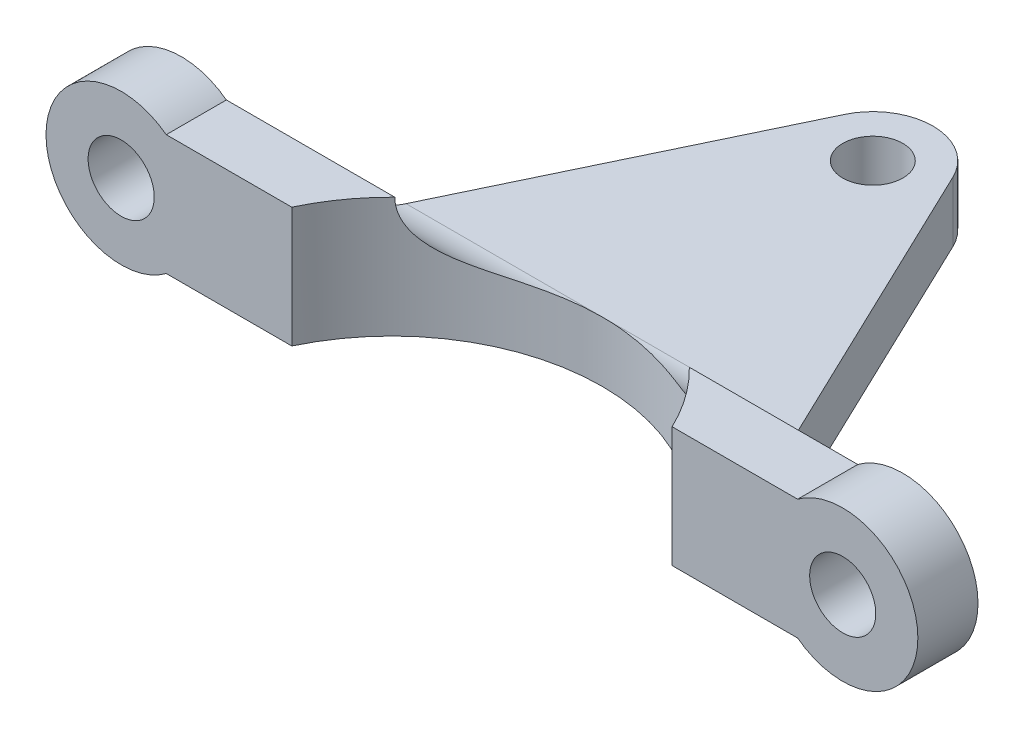
ISO-10303-21;
HEADER;
FILE_DESCRIPTION(('STEP AP214'),'2;1');
FILE_NAME('part.step','',(''),(''),'','','');
FILE_SCHEMA(('AUTOMOTIVE_DESIGN { 1 0 10303 214 1 1 1 1 }'));
ENDSEC;
DATA;
#1=APPLICATION_CONTEXT('core data for automotive mechanical design processes');
#2=APPLICATION_PROTOCOL_DEFINITION('international standard','automotive_design',2000,#1);
#3=PRODUCT_CONTEXT('',#1,'mechanical');
#4=PRODUCT('Part','Part','',(#3));
#5=PRODUCT_RELATED_PRODUCT_CATEGORY('part','',(#4));
#6=PRODUCT_DEFINITION_FORMATION('','',#4);
#7=PRODUCT_DEFINITION_CONTEXT('part definition',#1,'design');
#8=PRODUCT_DEFINITION('design','',#6,#7);
#9=PRODUCT_DEFINITION_SHAPE('','',#8);
#10=(LENGTH_UNIT() NAMED_UNIT(*) SI_UNIT(.MILLI.,.METRE.));
#11=(NAMED_UNIT(*) PLANE_ANGLE_UNIT() SI_UNIT($,.RADIAN.));
#12=(NAMED_UNIT(*) SI_UNIT($,.STERADIAN.) SOLID_ANGLE_UNIT());
#13=UNCERTAINTY_MEASURE_WITH_UNIT(LENGTH_MEASURE(1.E-05),#10,'distance_accuracy_value','');
#14=(GEOMETRIC_REPRESENTATION_CONTEXT(3) GLOBAL_UNCERTAINTY_ASSIGNED_CONTEXT((#13)) GLOBAL_UNIT_ASSIGNED_CONTEXT((#10,
#11,#12)) REPRESENTATION_CONTEXT('',''));
#15=CARTESIAN_POINT('',(0.,0.,0.));
#16=DIRECTION('',(0.,0.,1.));
#17=DIRECTION('',(1.,0.,0.));
#18=AXIS2_PLACEMENT_3D('',#15,#16,#17);
#19=CARTESIAN_POINT('',(0.,4.,0.));
#20=DIRECTION('',(0.,-1.,0.));
#21=DIRECTION('',(0.,0.,-1.));
#22=AXIS2_PLACEMENT_3D('',#19,#20,#21);
#23=CYLINDRICAL_SURFACE('',#22,7.);
#24=CARTESIAN_POINT('',(0.,4.,0.));
#25=DIRECTION('',(0.,1.,0.));
#26=DIRECTION('',(0.,0.,1.));
#27=AXIS2_PLACEMENT_3D('',#24,#25,#26);
#28=CIRCLE('',#27,7.);
#29=CARTESIAN_POINT('',(6.32455532033676,4.,-3.));
#30=VERTEX_POINT('',#29);
#31=CARTESIAN_POINT('',(4.89897948556636,4.,-5.));
#32=VERTEX_POINT('',#31);
#33=EDGE_CURVE('E322',#30,#32,#28,.T.);
#34=ORIENTED_EDGE('',*,*,#33,.T.);
#35=CARTESIAN_POINT('',(4.89897948556636,4.,-5.));
#36=CARTESIAN_POINT('',(4.89898466282606,3.95708928299442,-4.99999011477467));
#37=CARTESIAN_POINT('',(4.89757018635793,3.9141839310884,-5.00138071152142));
#38=CARTESIAN_POINT('',(4.89194243682955,3.82875317107511,-5.00688800031427));
#39=CARTESIAN_POINT('',(4.88773049843902,3.78622759157896,-5.01100339235699));
#40=CARTESIAN_POINT('',(4.87658371730419,3.70215140883431,-5.02185103416588));
#41=CARTESIAN_POINT('',(4.86966630909403,3.6605963332607,-5.0285665256923));
#42=CARTESIAN_POINT('',(4.85318900762016,3.57850582164685,-5.04447097514826));
#43=CARTESIAN_POINT('',(4.84362892737339,3.53797045797812,-5.05366010809983));
#44=CARTESIAN_POINT('',(4.81114979223824,3.41844524355401,-5.08465712922374));
#45=CARTESIAN_POINT('',(4.78440453850835,3.34133360602846,-5.10992194457505));
#46=CARTESIAN_POINT('',(4.72171847616023,3.19395103767314,-5.16790006243462));
#47=CARTESIAN_POINT('',(4.68576435549299,3.12369021490155,-5.20062414021882));
#48=CARTESIAN_POINT('',(4.59402216521894,2.97139945255398,-5.28201851181334));
#49=CARTESIAN_POINT('',(4.53551155914074,2.89200276999284,-5.33254617720228));
#50=CARTESIAN_POINT('',(4.40753583535792,2.74668487280889,-5.43880022426775));
#51=CARTESIAN_POINT('',(4.33805448474776,2.68078396452408,-5.49453425885883));
#52=CARTESIAN_POINT('',(4.2119291391148,2.57897225407792,-5.59142495749553));
#53=CARTESIAN_POINT('',(4.15741154816274,2.53990834494939,-5.63211804176578));
#54=CARTESIAN_POINT('',(4.0446870193621,2.46762638465617,-5.71361151161102));
#55=CARTESIAN_POINT('',(3.98647853424944,2.43441080751055,-5.75441193522174));
#56=CARTESIAN_POINT('',(3.80708383366466,2.3426298578724,-5.8759578696499));
#57=CARTESIAN_POINT('',(3.68119367474349,2.29198045069178,-5.95579714827815));
#58=CARTESIAN_POINT('',(3.44473424496656,2.2150406050174,-6.0950069083447));
#59=CARTESIAN_POINT('',(3.33562380754296,2.18598001799254,-6.15543607470735));
#60=CARTESIAN_POINT('',(3.11271522049934,2.13648995527161,-6.27110502722358));
#61=CARTESIAN_POINT('',(2.99891413042119,2.1160659868301,-6.32634148477412));
#62=CARTESIAN_POINT('',(2.76717212072766,2.08182378110782,-6.43109751360487));
#63=CARTESIAN_POINT('',(2.64921521027134,2.06803495858494,-6.4805909031358));
#64=CARTESIAN_POINT('',(2.41037925029539,2.04549887496969,-6.57316349526375));
#65=CARTESIAN_POINT('',(2.28950051317153,2.03675107736374,-6.61624338008454));
#66=CARTESIAN_POINT('',(1.99205542058784,2.01983132624954,-6.71310073666584));
#67=CARTESIAN_POINT('',(1.81422086313912,2.01357880821182,-6.76333520003789));
#68=CARTESIAN_POINT('',(1.45496991275704,2.00519125049863,-6.84961421178335));
#69=CARTESIAN_POINT('',(1.27355175224546,2.00305829671849,-6.88565156426122));
#70=CARTESIAN_POINT('',(1.00081484904496,2.00122353260286,-6.92868797589409));
#71=CARTESIAN_POINT('',(0.910331396789563,2.00083774674185,-6.94115545685817));
#72=CARTESIAN_POINT('',(0.728939698067638,2.00032170476223,-6.96254154349201));
#73=CARTESIAN_POINT('',(0.638031449812267,2.00019144972064,-6.97146013420351));
#74=CARTESIAN_POINT('',(0.456005424101805,2.00003767085754,-6.98572738059479));
#75=CARTESIAN_POINT('',(0.364887855905197,2.00001406676058,-6.99107871873402));
#76=CARTESIAN_POINT('',(0.182513762976024,2.00000026006483,-6.9982154545832));
#77=CARTESIAN_POINT('',(0.0912572391382384,2.00001005725185,-7.00000087515889));
#78=CARTESIAN_POINT('',(0.,1.99999999999999,-7.));
#79=B_SPLINE_CURVE_WITH_KNOTS('',3,(#35,#36,#37,#38,#39,#40,#41,#42,#43,#44,#45,#46,#47,#48,#49,
#50,#51,#52,#53,#54,#55,#56,#57,#58,#59,#60,#61,#62,#63,#64,#65,#66,#67,#68,#69,#70,#71,#72,#73,
#74,#75,#76,#77,#78),.UNSPECIFIED.,.F.,.F.,(4,2,2,2,2,2,2,2,2,2,2,2,2,2,2,2,2,2,2,2,2,4),(0.,
0.128677468159636,0.257293588327713,0.385094188754635,0.51290383406723,0.767912545999841,
1.02329199178864,1.35392829229567,1.6850584856187,1.92009035501073,2.15522141226318,
2.62577047129787,3.00950013363205,3.39347411864318,3.77913499361177,4.1647548153162,
4.71876068902529,5.27304700395315,5.54700670440895,5.82096755956902,6.09472217186828,
6.36847502876601),.UNSPECIFIED.);
#80=CARTESIAN_POINT('',(0.,2.,-7.));
#81=VERTEX_POINT('',#80);
#82=EDGE_CURVE('E234',#32,#81,#79,.T.);
#83=ORIENTED_EDGE('',*,*,#82,.T.);
#84=CARTESIAN_POINT('',(0.,2.,-7.));
#85=CARTESIAN_POINT('',(-0.0841627374007762,2.00000728041462,-7.0000006328622));
#86=CARTESIAN_POINT('',(-0.168324922142837,2.00000018950094,-6.99848213625596));
#87=CARTESIAN_POINT('',(-0.336540175151096,2.00001017569657,-6.99241173202552));
#88=CARTESIAN_POINT('',(-0.420593242963904,2.00002725290597,-6.98785981183734));
#89=CARTESIAN_POINT('',(-0.588521877138404,2.00013851356098,-6.9757244943503));
#90=CARTESIAN_POINT('',(-0.672397338835235,2.00023273404299,-6.9681396418384));
#91=CARTESIAN_POINT('',(-0.839815318769446,2.00060602194847,-6.94994977008053));
#92=CARTESIAN_POINT('',(-0.923357838037522,2.00088508879926,-6.93934476019147));
#93=CARTESIAN_POINT('',(-1.17464977939364,2.00220909662432,-6.90282515704987));
#94=CARTESIAN_POINT('',(-1.34175132320898,2.00374401545431,-6.87230054740542));
#95=CARTESIAN_POINT('',(-1.67319288607253,2.00976723653442,-6.79920673672789));
#96=CARTESIAN_POINT('',(-1.83753380558358,2.01425455580116,-6.75664154721906));
#97=CARTESIAN_POINT('',(-2.12042428628811,2.02669767249671,-6.6723006776526));
#98=CARTESIAN_POINT('',(-2.23981856661201,2.03345543342297,-6.63317101216628));
#99=CARTESIAN_POINT('',(-2.47608389806751,2.0511168278646,-6.54864464209965));
#100=CARTESIAN_POINT('',(-2.59295476015103,2.06202077087033,-6.5032474698446));
#101=CARTESIAN_POINT('',(-2.82319701048555,2.08938680948406,-6.40664409421189));
#102=CARTESIAN_POINT('',(-2.93657819099,2.10583143402452,-6.35545648236016));
#103=CARTESIAN_POINT('',(-3.15938039993261,2.14599582705055,-6.24768950820328));
#104=CARTESIAN_POINT('',(-3.26880329543186,2.16971211423311,-6.19111273487047));
#105=CARTESIAN_POINT('',(-3.51049505850911,2.23377817505717,-6.05805442110603));
#106=CARTESIAN_POINT('',(-3.64133107828445,2.27684636029529,-5.98021548603693));
#107=CARTESIAN_POINT('',(-3.89215354511507,2.38231059023905,-5.82006458379569));
#108=CARTESIAN_POINT('',(-4.01215382005732,2.44468153849342,-5.73775853845067));
#109=CARTESIAN_POINT('',(-4.2074374400217,2.57394246442586,-5.59536113582006));
#110=CARTESIAN_POINT('',(-4.2861933163182,2.63535478470063,-5.53510625526514));
#111=CARTESIAN_POINT('',(-4.43300941787114,2.77276939323256,-5.41822674488224));
#112=CARTESIAN_POINT('',(-4.50108557561797,2.84874956482298,-5.36159678341559));
#113=CARTESIAN_POINT('',(-4.61109926505255,2.99847108871577,-5.26706004179829));
#114=CARTESIAN_POINT('',(-4.65553245184837,3.06944900790252,-5.22769948851465));
#115=CARTESIAN_POINT('',(-4.73441211550996,3.22026998718729,-5.15637201663202));
#116=CARTESIAN_POINT('',(-4.76885723998095,3.3001142457753,-5.12440609939339));
#117=CARTESIAN_POINT('',(-4.82654018371074,3.46766670547408,-5.07011932778717));
#118=CARTESIAN_POINT('',(-4.84968537252599,3.55543313758997,-5.04787834270229));
#119=CARTESIAN_POINT('',(-4.88318147219514,3.73541218706479,-5.01548604832721));
#120=CARTESIAN_POINT('',(-4.89357005407435,3.82761087366158,-5.00529914586385));
#121=CARTESIAN_POINT('',(-4.89789430940729,3.93343545799923,-5.00106279926394));
#122=CARTESIAN_POINT('',(-4.89830137001528,3.94674961597304,-5.00066421068768));
#123=CARTESIAN_POINT('',(-4.89884348783352,3.97337443752132,-5.00013338919784));
#124=CARTESIAN_POINT('',(-4.89897883755824,3.98668508941215,-5.0000008698434));
#125=CARTESIAN_POINT('',(-4.89897948556637,4.,-5.));
#126=B_SPLINE_CURVE_WITH_KNOTS('',3,(#84,#85,#86,#87,#88,#89,#90,#91,#92,#93,#94,#95,#96,#97,
#98,#99,#100,#101,#102,#103,#104,#105,#106,#107,#108,#109,#110,#111,#112,#113,#114,#115,#116,
#117,#118,#119,#120,#121,#122,#123,#124,#125),.UNSPECIFIED.,.F.,.F.,(4,2,2,2,2,2,2,2,2,2,2,2,2,
2,2,2,2,2,2,2,4),(0.,0.252473432377999,0.504947910469367,0.757543672456671,1.0101386518705,
1.51926623204327,2.02822438707148,2.40547777686093,2.78275933213095,3.15886219389698,
3.53478527710818,4.00818074615952,4.48096329844102,4.82972084102823,5.17795303933857,
5.4544453873116,5.73097515519377,6.0097352078388,6.28767007013125,6.32764799491806,
6.36758285773509),.UNSPECIFIED.);
#127=CARTESIAN_POINT('',(-4.89897948556636,4.,-5.));
#128=VERTEX_POINT('',#127);
#129=EDGE_CURVE('E257',#81,#128,#126,.T.);
#130=ORIENTED_EDGE('',*,*,#129,.T.);
#131=CARTESIAN_POINT('',(-6.32455532033676,4.,-3.));
#132=VERTEX_POINT('',#131);
#133=EDGE_CURVE('E296',#128,#132,#28,.T.);
#134=ORIENTED_EDGE('',*,*,#133,.T.);
#135=DIRECTION('',(0.,-1.,0.));
#136=VECTOR('',#135,1.);
#137=CARTESIAN_POINT('',(-6.32455532033676,4.,-3.));
#138=LINE('',#137,#136);
#139=CARTESIAN_POINT('',(-6.32455532033676,0.,-3.));
#140=VERTEX_POINT('',#139);
#141=EDGE_CURVE('E211',#132,#140,#138,.T.);
#142=ORIENTED_EDGE('',*,*,#141,.T.);
#143=CARTESIAN_POINT('',(0.,0.,0.));
#144=DIRECTION('',(0.,1.,0.));
#145=DIRECTION('',(0.,0.,1.));
#146=AXIS2_PLACEMENT_3D('',#143,#144,#145);
#147=CIRCLE('',#146,7.);
#148=CARTESIAN_POINT('',(6.32455532033676,0.,-3.));
#149=VERTEX_POINT('',#148);
#150=EDGE_CURVE('E183',#149,#140,#147,.T.);
#151=ORIENTED_EDGE('',*,*,#150,.F.);
#152=DIRECTION('',(0.,-1.,0.));
#153=VECTOR('',#152,1.);
#154=CARTESIAN_POINT('',(6.32455532033676,4.,-3.));
#155=LINE('',#154,#153);
#156=EDGE_CURVE('E182',#30,#149,#155,.T.);
#157=ORIENTED_EDGE('',*,*,#156,.F.);
#158=EDGE_LOOP('',(#34,#83,#130,#134,#142,#151,#157));
#159=FACE_BOUND('',#158,.T.);
#160=ADVANCED_FACE('F53',(#159),#23,.F.);
#161=CARTESIAN_POINT('',(8.03540956693639,4.,-3.84673390666092));
#162=DIRECTION('',(-0.901971979461699,0.,0.431794567202905));
#163=DIRECTION('',(0.431794567202905,0.,0.901971979461699));
#164=AXIS2_PLACEMENT_3D('',#161,#162,#163);
#165=PLANE('',#164);
#166=DIRECTION('',(-0.431794567202905,0.,-0.901971979461699));
#167=VECTOR('',#166,1.);
#168=CARTESIAN_POINT('',(8.03540956693639,2.,-3.84673390666092));
#169=LINE('',#168,#167);
#170=CARTESIAN_POINT('',(6.52586913879413,2.,-7.));
#171=VERTEX_POINT('',#170);
#172=CARTESIAN_POINT('',(1.8039439589234,2.,-16.8635891344058));
#173=VERTEX_POINT('',#172);
#174=EDGE_CURVE('E317',#171,#173,#169,.T.);
#175=ORIENTED_EDGE('',*,*,#174,.F.);
#176=CARTESIAN_POINT('',(6.52586913879413,4.,-7.));
#177=DIRECTION('',(-0.901971979461699,0.,0.431794567202905));
#178=DIRECTION('',(0.431794567202905,0.,0.901971979461699));
#179=AXIS2_PLACEMENT_3D('',#176,#177,#178);
#180=ELLIPSE('',#179,2.21736378240221,2.);
#181=CARTESIAN_POINT('',(6.66727605663546,2.02193314854529,-6.70461629839128));
#182=VERTEX_POINT('',#181);
#183=EDGE_CURVE('E241',#171,#182,#180,.T.);
#184=ORIENTED_EDGE('',*,*,#183,.T.);
#185=DIRECTION('',(0.,-1.,0.));
#186=VECTOR('',#185,1.);
#187=CARTESIAN_POINT('',(6.66727605663546,4.,-6.70461629839128));
#188=LINE('',#187,#186);
#189=CARTESIAN_POINT('',(6.66727605663546,0.,-6.70461629839128));
#190=VERTEX_POINT('',#189);
#191=EDGE_CURVE('E77',#182,#190,#188,.T.);
#192=ORIENTED_EDGE('',*,*,#191,.T.);
#193=DIRECTION('',(-0.431794567202905,0.,-0.901971979461699));
#194=VECTOR('',#193,1.);
#195=CARTESIAN_POINT('',(8.03540956693639,0.,-3.84673390666092));
#196=LINE('',#195,#194);
#197=CARTESIAN_POINT('',(1.8039439589234,0.,-16.8635891344058));
#198=VERTEX_POINT('',#197);
#199=EDGE_CURVE('E185',#190,#198,#196,.T.);
#200=ORIENTED_EDGE('',*,*,#199,.T.);
#201=DIRECTION('',(0.,-1.,0.));
#202=VECTOR('',#201,1.);
#203=CARTESIAN_POINT('',(1.8039439589234,4.,-16.8635891344058));
#204=LINE('',#203,#202);
#205=EDGE_CURVE('E206',#173,#198,#204,.T.);
#206=ORIENTED_EDGE('',*,*,#205,.F.);
#207=EDGE_LOOP('',(#175,#184,#192,#200,#206));
#208=FACE_BOUND('',#207,.T.);
#209=ADVANCED_FACE('F250',(#208),#165,.F.);
#210=CARTESIAN_POINT('',(0.,4.,-16.));
#211=DIRECTION('',(0.,-1.,0.));
#212=DIRECTION('',(0.,0.,-1.));
#213=AXIS2_PLACEMENT_3D('',#210,#211,#212);
#214=CYLINDRICAL_SURFACE('',#213,2.);
#215=CARTESIAN_POINT('',(0.,2.,-16.));
#216=DIRECTION('',(0.,1.,0.));
#217=DIRECTION('',(0.,0.,1.));
#218=AXIS2_PLACEMENT_3D('',#215,#216,#217);
#219=CIRCLE('',#218,2.);
#220=CARTESIAN_POINT('',(-1.8039439589234,2.,-16.8635891344058));
#221=VERTEX_POINT('',#220);
#222=EDGE_CURVE('E345',#173,#221,#219,.T.);
#223=ORIENTED_EDGE('',*,*,#222,.F.);
#224=ORIENTED_EDGE('',*,*,#205,.T.);
#225=CARTESIAN_POINT('',(0.,0.,-16.));
#226=DIRECTION('',(0.,1.,0.));
#227=DIRECTION('',(0.,0.,1.));
#228=AXIS2_PLACEMENT_3D('',#225,#226,#227);
#229=CIRCLE('',#228,2.);
#230=CARTESIAN_POINT('',(-1.8039439589234,0.,-16.8635891344058));
#231=VERTEX_POINT('',#230);
#232=EDGE_CURVE('E192',#198,#231,#229,.T.);
#233=ORIENTED_EDGE('',*,*,#232,.T.);
#234=DIRECTION('',(0.,-1.,0.));
#235=VECTOR('',#234,1.);
#236=CARTESIAN_POINT('',(-1.8039439589234,4.,-16.8635891344058));
#237=LINE('',#236,#235);
#238=EDGE_CURVE('E203',#221,#231,#237,.T.);
#239=ORIENTED_EDGE('',*,*,#238,.F.);
#240=EDGE_LOOP('',(#223,#224,#233,#239));
#241=FACE_BOUND('',#240,.T.);
#242=ADVANCED_FACE('F354',(#241),#214,.T.);
#243=CARTESIAN_POINT('',(-8.03540956693639,4.,-3.84673390666092));
#244=DIRECTION('',(-0.901971979461699,0.,-0.431794567202905));
#245=DIRECTION('',(-0.431794567202905,0.,0.901971979461699));
#246=AXIS2_PLACEMENT_3D('',#243,#244,#245);
#247=PLANE('',#246);
#248=DIRECTION('',(0.431794567202905,0.,-0.901971979461699));
#249=VECTOR('',#248,1.);
#250=CARTESIAN_POINT('',(-8.03540956693639,0.,-3.84673390666092));
#251=LINE('',#250,#249);
#252=CARTESIAN_POINT('',(-6.66727605663546,0.,-6.70461629839128));
#253=VERTEX_POINT('',#252);
#254=EDGE_CURVE('E195',#253,#231,#251,.T.);
#255=ORIENTED_EDGE('',*,*,#254,.F.);
#256=DIRECTION('',(0.,-1.,0.));
#257=VECTOR('',#256,1.);
#258=CARTESIAN_POINT('',(-6.66727605663546,2.,-6.70461629839128));
#259=LINE('',#258,#257);
#260=CARTESIAN_POINT('',(-6.66727605663546,2.02193314854529,-6.70461629839128));
#261=VERTEX_POINT('',#260);
#262=EDGE_CURVE('E69',#253,#261,#259,.F.);
#263=ORIENTED_EDGE('',*,*,#262,.T.);
#264=CARTESIAN_POINT('',(-6.52586913879413,4.,-7.));
#265=DIRECTION('',(-0.901971979461699,0.,-0.431794567202905));
#266=DIRECTION('',(0.431794567202905,0.,-0.901971979461699));
#267=AXIS2_PLACEMENT_3D('',#264,#265,#266);
#268=ELLIPSE('',#267,2.21736378240221,2.);
#269=CARTESIAN_POINT('',(-6.52586913879413,2.,-7.));
#270=VERTEX_POINT('',#269);
#271=EDGE_CURVE('E263',#261,#270,#268,.F.);
#272=ORIENTED_EDGE('',*,*,#271,.T.);
#273=DIRECTION('',(0.431794567202905,0.,-0.901971979461699));
#274=VECTOR('',#273,1.);
#275=CARTESIAN_POINT('',(-8.03540956693639,2.,-3.84673390666092));
#276=LINE('',#275,#274);
#277=EDGE_CURVE('E216',#270,#221,#276,.T.);
#278=ORIENTED_EDGE('',*,*,#277,.T.);
#279=ORIENTED_EDGE('',*,*,#238,.T.);
#280=EDGE_LOOP('',(#255,#263,#272,#278,#279));
#281=FACE_BOUND('',#280,.T.);
#282=ADVANCED_FACE('F357',(#281),#247,.T.);
#283=CARTESIAN_POINT('',(0.,4.,-16.));
#284=DIRECTION('',(0.,-1.,0.));
#285=DIRECTION('',(0.,0.,-1.));
#286=AXIS2_PLACEMENT_3D('',#283,#284,#285);
#287=CYLINDRICAL_SURFACE('',#286,1.);
#288=CARTESIAN_POINT('',(0.,0.,-16.));
#289=DIRECTION('',(0.,1.,0.));
#290=DIRECTION('',(0.,0.,1.));
#291=AXIS2_PLACEMENT_3D('',#288,#289,#290);
#292=CIRCLE('',#291,1.);
#293=CARTESIAN_POINT('',(0.,0.,-15.));
#294=VERTEX_POINT('',#293);
#295=EDGE_CURVE('E199',#294,#294,#292,.T.);
#296=ORIENTED_EDGE('',*,*,#295,.F.);
#297=EDGE_LOOP('',(#296));
#298=FACE_BOUND('',#297,.T.);
#299=CARTESIAN_POINT('',(0.,2.,-16.));
#300=DIRECTION('',(0.,1.,0.));
#301=DIRECTION('',(0.,0.,1.));
#302=AXIS2_PLACEMENT_3D('',#299,#300,#301);
#303=CIRCLE('',#302,1.);
#304=CARTESIAN_POINT('',(0.,2.,-15.));
#305=VERTEX_POINT('',#304);
#306=EDGE_CURVE('E213',#305,#305,#303,.T.);
#307=ORIENTED_EDGE('',*,*,#306,.T.);
#308=EDGE_LOOP('',(#307));
#309=FACE_BOUND('',#308,.T.);
#310=ADVANCED_FACE('F359',(#298,#309),#287,.F.);
#311=CARTESIAN_POINT('',(0.,4.,0.));
#312=DIRECTION('',(0.,1.,0.));
#313=DIRECTION('',(0.,0.,1.));
#314=AXIS2_PLACEMENT_3D('',#311,#312,#313);
#315=PLANE('',#314);
#316=DIRECTION('',(0.,0.,-1.));
#317=VECTOR('',#316,1.);
#318=CARTESIAN_POINT('',(10.5,4.,4.07106781186548));
#319=LINE('',#318,#317);
#320=CARTESIAN_POINT('',(10.5,4.,-5.));
#321=VERTEX_POINT('',#320);
#322=CARTESIAN_POINT('',(10.5,4.,-3.));
#323=VERTEX_POINT('',#322);
#324=EDGE_CURVE('E163',#321,#323,#319,.F.);
#325=ORIENTED_EDGE('',*,*,#324,.F.);
#326=DIRECTION('',(1.,0.,0.));
#327=VECTOR('',#326,1.);
#328=CARTESIAN_POINT('',(0.,4.,-5.));
#329=LINE('',#328,#327);
#330=CARTESIAN_POINT('',(9.37319199502056,4.,-5.));
#331=VERTEX_POINT('',#330);
#332=EDGE_CURVE('E300',#331,#321,#329,.T.);
#333=ORIENTED_EDGE('',*,*,#332,.F.);
#334=EDGE_CURVE('E297',#32,#331,#329,.T.);
#335=ORIENTED_EDGE('',*,*,#334,.F.);
#336=ORIENTED_EDGE('',*,*,#33,.F.);
#337=DIRECTION('',(1.,0.,0.));
#338=VECTOR('',#337,1.);
#339=CARTESIAN_POINT('',(0.,4.,-3.));
#340=LINE('',#339,#338);
#341=EDGE_CURVE('E324',#30,#323,#340,.T.);
#342=ORIENTED_EDGE('',*,*,#341,.T.);
#343=EDGE_LOOP('',(#325,#333,#335,#336,#342));
#344=FACE_BOUND('',#343,.T.);
#345=ADVANCED_FACE('F334',(#344),#315,.T.);
#346=DIRECTION('',(0.,0.,-1.));
#347=VECTOR('',#346,1.);
#348=CARTESIAN_POINT('',(-10.5,4.,4.07106781186548));
#349=LINE('',#348,#347);
#350=CARTESIAN_POINT('',(-10.5,4.,-3.));
#351=VERTEX_POINT('',#350);
#352=CARTESIAN_POINT('',(-10.5,4.,-5.));
#353=VERTEX_POINT('',#352);
#354=EDGE_CURVE('E217',#351,#353,#349,.T.);
#355=ORIENTED_EDGE('',*,*,#354,.F.);
#356=DIRECTION('',(-1.,0.,0.));
#357=VECTOR('',#356,1.);
#358=CARTESIAN_POINT('',(0.,4.,-3.));
#359=LINE('',#358,#357);
#360=EDGE_CURVE('E202',#132,#351,#359,.T.);
#361=ORIENTED_EDGE('',*,*,#360,.F.);
#362=ORIENTED_EDGE('',*,*,#133,.F.);
#363=DIRECTION('',(1.,0.,0.));
#364=VECTOR('',#363,1.);
#365=CARTESIAN_POINT('',(0.,4.,-5.));
#366=LINE('',#365,#364);
#367=CARTESIAN_POINT('',(-9.37319199502056,4.,-5.));
#368=VERTEX_POINT('',#367);
#369=EDGE_CURVE('E288',#368,#128,#366,.T.);
#370=ORIENTED_EDGE('',*,*,#369,.F.);
#371=EDGE_CURVE('E207',#353,#368,#366,.T.);
#372=ORIENTED_EDGE('',*,*,#371,.F.);
#373=EDGE_LOOP('',(#355,#361,#362,#370,#372));
#374=FACE_BOUND('',#373,.T.);
#375=ADVANCED_FACE('F294',(#374),#315,.T.);
#376=CARTESIAN_POINT('',(0.,4.,-3.));
#377=DIRECTION('',(0.,0.,1.));
#378=DIRECTION('',(1.,0.,0.));
#379=AXIS2_PLACEMENT_3D('',#376,#377,#378);
#380=PLANE('',#379);
#381=ORIENTED_EDGE('',*,*,#360,.T.);
#382=CARTESIAN_POINT('',(-12.,2.,-3.));
#383=DIRECTION('',(0.,0.,-1.));
#384=DIRECTION('',(-1.,0.,0.));
#385=AXIS2_PLACEMENT_3D('',#382,#383,#384);
#386=CIRCLE('',#385,2.5);
#387=CARTESIAN_POINT('',(-10.5,0.,-3.));
#388=VERTEX_POINT('',#387);
#389=EDGE_CURVE('E630',#351,#388,#386,.F.);
#390=ORIENTED_EDGE('',*,*,#389,.T.);
#391=DIRECTION('',(-1.,0.,0.));
#392=VECTOR('',#391,1.);
#393=CARTESIAN_POINT('',(0.,0.,-3.));
#394=LINE('',#393,#392);
#395=EDGE_CURVE('E187',#140,#388,#394,.T.);
#396=ORIENTED_EDGE('',*,*,#395,.F.);
#397=ORIENTED_EDGE('',*,*,#141,.F.);
#398=EDGE_LOOP('',(#381,#390,#396,#397));
#399=FACE_BOUND('',#398,.T.);
#400=CARTESIAN_POINT('',(-12.,2.,-3.));
#401=DIRECTION('',(0.,0.,-1.));
#402=DIRECTION('',(-1.,0.,0.));
#403=AXIS2_PLACEMENT_3D('',#400,#401,#402);
#404=CIRCLE('',#403,1.1);
#405=CARTESIAN_POINT('',(-13.1,2.,-3.));
#406=VERTEX_POINT('',#405);
#407=EDGE_CURVE('E314',#406,#406,#404,.F.);
#408=ORIENTED_EDGE('',*,*,#407,.F.);
#409=EDGE_LOOP('',(#408));
#410=FACE_BOUND('',#409,.T.);
#411=ADVANCED_FACE('F253',(#399,#410),#380,.T.);
#412=CARTESIAN_POINT('',(0.,4.,-3.));
#413=DIRECTION('',(0.,0.,-1.));
#414=DIRECTION('',(-1.,0.,0.));
#415=AXIS2_PLACEMENT_3D('',#412,#413,#414);
#416=PLANE('',#415);
#417=CARTESIAN_POINT('',(12.,2.,-3.));
#418=DIRECTION('',(0.,0.,-1.));
#419=DIRECTION('',(-1.,0.,0.));
#420=AXIS2_PLACEMENT_3D('',#417,#418,#419);
#421=CIRCLE('',#420,2.5);
#422=CARTESIAN_POINT('',(10.5,0.,-3.));
#423=VERTEX_POINT('',#422);
#424=EDGE_CURVE('E159',#423,#323,#421,.F.);
#425=ORIENTED_EDGE('',*,*,#424,.T.);
#426=ORIENTED_EDGE('',*,*,#341,.F.);
#427=ORIENTED_EDGE('',*,*,#156,.T.);
#428=DIRECTION('',(1.,0.,0.));
#429=VECTOR('',#428,1.);
#430=CARTESIAN_POINT('',(0.,0.,-3.));
#431=LINE('',#430,#429);
#432=EDGE_CURVE('E176',#149,#423,#431,.T.);
#433=ORIENTED_EDGE('',*,*,#432,.T.);
#434=EDGE_LOOP('',(#425,#426,#427,#433));
#435=FACE_BOUND('',#434,.T.);
#436=CARTESIAN_POINT('',(12.,2.,-3.));
#437=DIRECTION('',(0.,0.,-1.));
#438=DIRECTION('',(-1.,0.,0.));
#439=AXIS2_PLACEMENT_3D('',#436,#437,#438);
#440=CIRCLE('',#439,1.1);
#441=CARTESIAN_POINT('',(10.9,2.,-3.));
#442=VERTEX_POINT('',#441);
#443=EDGE_CURVE('E303',#442,#442,#440,.F.);
#444=ORIENTED_EDGE('',*,*,#443,.F.);
#445=EDGE_LOOP('',(#444));
#446=FACE_BOUND('',#445,.T.);
#447=ADVANCED_FACE('F180',(#435,#446),#416,.F.);
#448=CARTESIAN_POINT('',(0.,4.,-5.));
#449=DIRECTION('',(0.,0.,-1.));
#450=DIRECTION('',(-1.,0.,0.));
#451=AXIS2_PLACEMENT_3D('',#448,#449,#450);
#452=PLANE('',#451);
#453=ORIENTED_EDGE('',*,*,#332,.T.);
#454=CARTESIAN_POINT('',(12.,2.,-5.));
#455=DIRECTION('',(0.,0.,-1.));
#456=DIRECTION('',(-1.,0.,0.));
#457=AXIS2_PLACEMENT_3D('',#454,#455,#456);
#458=CIRCLE('',#457,2.5);
#459=CARTESIAN_POINT('',(10.5,0.,-5.));
#460=VERTEX_POINT('',#459);
#461=EDGE_CURVE('E168',#321,#460,#458,.T.);
#462=ORIENTED_EDGE('',*,*,#461,.T.);
#463=DIRECTION('',(1.,0.,0.));
#464=VECTOR('',#463,1.);
#465=CARTESIAN_POINT('',(0.,0.,-5.));
#466=LINE('',#465,#464);
#467=CARTESIAN_POINT('',(9.37319199502056,0.,-5.));
#468=VERTEX_POINT('',#467);
#469=EDGE_CURVE('E179',#468,#460,#466,.T.);
#470=ORIENTED_EDGE('',*,*,#469,.F.);
#471=DIRECTION('',(0.,-1.,0.));
#472=VECTOR('',#471,1.);
#473=CARTESIAN_POINT('',(9.37319199502056,4.,-5.));
#474=LINE('',#473,#472);
#475=EDGE_CURVE('E219',#468,#331,#474,.F.);
#476=ORIENTED_EDGE('',*,*,#475,.T.);
#477=EDGE_LOOP('',(#453,#462,#470,#476));
#478=FACE_BOUND('',#477,.T.);
#479=CARTESIAN_POINT('',(12.,2.,-5.));
#480=DIRECTION('',(0.,0.,-1.));
#481=DIRECTION('',(-1.,0.,0.));
#482=AXIS2_PLACEMENT_3D('',#479,#480,#481);
#483=CIRCLE('',#482,1.1);
#484=CARTESIAN_POINT('',(10.9,2.,-5.));
#485=VERTEX_POINT('',#484);
#486=EDGE_CURVE('E305',#485,#485,#483,.T.);
#487=ORIENTED_EDGE('',*,*,#486,.F.);
#488=EDGE_LOOP('',(#487));
#489=FACE_BOUND('',#488,.T.);
#490=ADVANCED_FACE('F330',(#478,#489),#452,.T.);
#491=CARTESIAN_POINT('',(0.,4.,-5.));
#492=DIRECTION('',(0.,0.,-1.));
#493=DIRECTION('',(-1.,0.,0.));
#494=AXIS2_PLACEMENT_3D('',#491,#492,#493);
#495=PLANE('',#494);
#496=CARTESIAN_POINT('',(-12.,2.,-5.));
#497=DIRECTION('',(0.,0.,-1.));
#498=DIRECTION('',(-1.,0.,0.));
#499=AXIS2_PLACEMENT_3D('',#496,#497,#498);
#500=CIRCLE('',#499,2.5);
#501=CARTESIAN_POINT('',(-10.5,0.,-5.));
#502=VERTEX_POINT('',#501);
#503=EDGE_CURVE('E276',#502,#353,#500,.T.);
#504=ORIENTED_EDGE('',*,*,#503,.T.);
#505=ORIENTED_EDGE('',*,*,#371,.T.);
#506=DIRECTION('',(0.,-1.,0.));
#507=VECTOR('',#506,1.);
#508=CARTESIAN_POINT('',(-9.37319199502056,0.,-5.));
#509=LINE('',#508,#507);
#510=CARTESIAN_POINT('',(-9.37319199502056,0.,-5.));
#511=VERTEX_POINT('',#510);
#512=EDGE_CURVE('E221',#368,#511,#509,.T.);
#513=ORIENTED_EDGE('',*,*,#512,.T.);
#514=DIRECTION('',(1.,0.,0.));
#515=VECTOR('',#514,1.);
#516=CARTESIAN_POINT('',(0.,0.,-5.));
#517=LINE('',#516,#515);
#518=EDGE_CURVE('E197',#502,#511,#517,.T.);
#519=ORIENTED_EDGE('',*,*,#518,.F.);
#520=EDGE_LOOP('',(#504,#505,#513,#519));
#521=FACE_BOUND('',#520,.T.);
#522=CARTESIAN_POINT('',(-12.,2.,-5.));
#523=DIRECTION('',(0.,0.,-1.));
#524=DIRECTION('',(-1.,0.,0.));
#525=AXIS2_PLACEMENT_3D('',#522,#523,#524);
#526=CIRCLE('',#525,1.1);
#527=CARTESIAN_POINT('',(-13.1,2.,-5.));
#528=VERTEX_POINT('',#527);
#529=EDGE_CURVE('E310',#528,#528,#526,.T.);
#530=ORIENTED_EDGE('',*,*,#529,.F.);
#531=EDGE_LOOP('',(#530));
#532=FACE_BOUND('',#531,.T.);
#533=ADVANCED_FACE('F274',(#521,#532),#495,.T.);
#534=CARTESIAN_POINT('',(0.,0.,0.));
#535=DIRECTION('',(0.,1.,0.));
#536=DIRECTION('',(0.,0.,1.));
#537=AXIS2_PLACEMENT_3D('',#534,#535,#536);
#538=PLANE('',#537);
#539=ORIENTED_EDGE('',*,*,#469,.T.);
#540=DIRECTION('',(0.,0.,-1.));
#541=VECTOR('',#540,1.);
#542=CARTESIAN_POINT('',(10.5,0.,4.07106781186548));
#543=LINE('',#542,#541);
#544=EDGE_CURVE('E11',#460,#423,#543,.F.);
#545=ORIENTED_EDGE('',*,*,#544,.T.);
#546=ORIENTED_EDGE('',*,*,#432,.F.);
#547=ORIENTED_EDGE('',*,*,#150,.T.);
#548=ORIENTED_EDGE('',*,*,#395,.T.);
#549=DIRECTION('',(0.,0.,-1.));
#550=VECTOR('',#549,1.);
#551=CARTESIAN_POINT('',(-10.5,0.,4.07106781186548));
#552=LINE('',#551,#550);
#553=EDGE_CURVE('E62',#388,#502,#552,.T.);
#554=ORIENTED_EDGE('',*,*,#553,.T.);
#555=ORIENTED_EDGE('',*,*,#518,.T.);
#556=CARTESIAN_POINT('',(-9.37319199502056,0.,-8.));
#557=DIRECTION('',(0.,1.,0.));
#558=DIRECTION('',(0.,0.,1.));
#559=AXIS2_PLACEMENT_3D('',#556,#557,#558);
#560=CIRCLE('',#559,3.);
#561=EDGE_CURVE('E227',#511,#253,#560,.T.);
#562=ORIENTED_EDGE('',*,*,#561,.T.);
#563=ORIENTED_EDGE('',*,*,#254,.T.);
#564=ORIENTED_EDGE('',*,*,#232,.F.);
#565=ORIENTED_EDGE('',*,*,#199,.F.);
#566=CARTESIAN_POINT('',(9.37319199502056,0.,-8.));
#567=DIRECTION('',(0.,1.,0.));
#568=DIRECTION('',(0.,0.,1.));
#569=AXIS2_PLACEMENT_3D('',#566,#567,#568);
#570=CIRCLE('',#569,3.);
#571=EDGE_CURVE('E225',#190,#468,#570,.T.);
#572=ORIENTED_EDGE('',*,*,#571,.T.);
#573=EDGE_LOOP('',(#539,#545,#546,#547,#548,#554,#555,#562,#563,#564,#565,#572));
#574=FACE_BOUND('',#573,.T.);
#575=ORIENTED_EDGE('',*,*,#295,.T.);
#576=EDGE_LOOP('',(#575));
#577=FACE_BOUND('',#576,.T.);
#578=ADVANCED_FACE('F173',(#574,#577),#538,.F.);
#579=CARTESIAN_POINT('',(-12.,2.,0.111269837220814));
#580=DIRECTION('',(0.,0.,-1.));
#581=DIRECTION('',(-1.,0.,0.));
#582=AXIS2_PLACEMENT_3D('',#579,#580,#581);
#583=CYLINDRICAL_SURFACE('',#582,1.1);
#584=ORIENTED_EDGE('',*,*,#407,.T.);
#585=EDGE_LOOP('',(#584));
#586=FACE_BOUND('',#585,.T.);
#587=ORIENTED_EDGE('',*,*,#529,.T.);
#588=EDGE_LOOP('',(#587));
#589=FACE_BOUND('',#588,.T.);
#590=ADVANCED_FACE('F389',(#586,#589),#583,.F.);
#591=CARTESIAN_POINT('',(12.,2.,0.111269837220814));
#592=DIRECTION('',(0.,0.,-1.));
#593=DIRECTION('',(-1.,0.,0.));
#594=AXIS2_PLACEMENT_3D('',#591,#592,#593);
#595=CYLINDRICAL_SURFACE('',#594,1.1);
#596=ORIENTED_EDGE('',*,*,#443,.T.);
#597=EDGE_LOOP('',(#596));
#598=FACE_BOUND('',#597,.T.);
#599=ORIENTED_EDGE('',*,*,#486,.T.);
#600=EDGE_LOOP('',(#599));
#601=FACE_BOUND('',#600,.T.);
#602=ADVANCED_FACE('F392',(#598,#601),#595,.F.);
#603=CARTESIAN_POINT('',(7.48331477354788,2.,-28.));
#604=DIRECTION('',(0.,1.,0.));
#605=DIRECTION('',(0.,0.,1.));
#606=AXIS2_PLACEMENT_3D('',#603,#604,#605);
#607=PLANE('',#606);
#608=ORIENTED_EDGE('',*,*,#306,.F.);
#609=EDGE_LOOP('',(#608));
#610=FACE_BOUND('',#609,.T.);
#611=DIRECTION('',(-1.,0.,0.));
#612=VECTOR('',#611,1.);
#613=CARTESIAN_POINT('',(-4.89897948556636,2.,-7.));
#614=LINE('',#613,#612);
#615=EDGE_CURVE('E229',#270,#81,#614,.F.);
#616=ORIENTED_EDGE('',*,*,#615,.T.);
#617=DIRECTION('',(-1.,0.,0.));
#618=VECTOR('',#617,1.);
#619=CARTESIAN_POINT('',(9.37319199502056,2.,-7.));
#620=LINE('',#619,#618);
#621=EDGE_CURVE('E232',#81,#171,#620,.F.);
#622=ORIENTED_EDGE('',*,*,#621,.T.);
#623=ORIENTED_EDGE('',*,*,#174,.T.);
#624=ORIENTED_EDGE('',*,*,#222,.T.);
#625=ORIENTED_EDGE('',*,*,#277,.F.);
#626=EDGE_LOOP('',(#616,#622,#623,#624,#625));
#627=FACE_BOUND('',#626,.T.);
#628=ADVANCED_FACE('F341',(#610,#627),#607,.T.);
#629=CARTESIAN_POINT('',(9.37319199502056,4.,-8.));
#630=DIRECTION('',(0.,-1.,0.));
#631=DIRECTION('',(0.,0.,-1.));
#632=AXIS2_PLACEMENT_3D('',#629,#630,#631);
#633=CYLINDRICAL_SURFACE('',#632,3.);
#634=ORIENTED_EDGE('',*,*,#191,.F.);
#635=CARTESIAN_POINT('',(6.66727605663546,2.02193314854529,-6.70461629839128));
#636=CARTESIAN_POINT('',(6.69595371337941,2.03088103762847,-6.64469349750106));
#637=CARTESIAN_POINT('',(6.72645514263051,2.04241266914044,-6.58610854774002));
#638=CARTESIAN_POINT('',(6.79066428310625,2.07006638497519,-6.47198863785929));
#639=CARTESIAN_POINT('',(6.82436608501774,2.0861801143961,-6.41644834404033));
#640=CARTESIAN_POINT('',(6.92901291098772,2.14020058045535,-6.25581132908599));
#641=CARTESIAN_POINT('',(7.00414096362185,2.18400645162127,-6.15538337809523));
#642=CARTESIAN_POINT('',(7.18581190901094,2.2980058217821,-5.9407413811419));
#643=CARTESIAN_POINT('',(7.29512526119964,2.37216924470112,-5.83105371228013));
#644=CARTESIAN_POINT('',(7.52358185511013,2.53432311314688,-5.63316021112782));
#645=CARTESIAN_POINT('',(7.64277673002593,2.62238868519649,-5.54507815355631));
#646=CARTESIAN_POINT('',(7.8494585926284,2.77891684372022,-5.41383785569768));
#647=CARTESIAN_POINT('',(7.9353535036701,2.84502072110917,-5.36521035458579));
#648=CARTESIAN_POINT('',(8.10937581886698,2.98051686011984,-5.27745242829439));
#649=CARTESIAN_POINT('',(8.1975033271717,3.04990927528212,-5.23832244707361));
#650=CARTESIAN_POINT('',(8.37526658154823,3.1910102437634,-5.16923606058087));
#651=CARTESIAN_POINT('',(8.4649002601218,3.26271572942666,-5.13926801615546));
#652=CARTESIAN_POINT('',(8.64526741256145,3.4077865709613,-5.08814190979442));
#653=CARTESIAN_POINT('',(8.73600090031898,3.48115194780855,-5.06698395925666));
#654=CARTESIAN_POINT('',(9.00538269425699,3.69969287645925,-5.01712115556706));
#655=CARTESIAN_POINT('',(9.18520248093635,3.84650731415408,-5.00051942941791));
#656=CARTESIAN_POINT('',(9.36753522065425,3.99538126428732,-5.00000400429124));
#657=CARTESIAN_POINT('',(9.37036365073317,3.99769066800497,-5.00000000466731));
#658=CARTESIAN_POINT('',(9.37319199502056,4.,-5.));
#659=B_SPLINE_CURVE_WITH_KNOTS('',3,(#635,#636,#637,#638,#639,#640,#641,#642,#643,#644,#645,
#646,#647,#648,#649,#650,#651,#652,#653,#654,#655,#656,#657,#658),.UNSPECIFIED.,.F.,.F.,(4,2,2,
2,2,2,2,2,2,2,2,4),(0.,0.200893001879377,0.4014220229774,0.798107634640086,1.31052837757378,
1.82581950313228,2.18177559222345,2.53774831717267,2.89326692367008,3.2487900253311,
3.94398735712823,3.95494181485274),.UNSPECIFIED.);
#660=EDGE_CURVE('E290',#182,#331,#659,.T.);
#661=ORIENTED_EDGE('',*,*,#660,.T.);
#662=ORIENTED_EDGE('',*,*,#475,.F.);
#663=ORIENTED_EDGE('',*,*,#571,.F.);
#664=EDGE_LOOP('',(#634,#661,#662,#663));
#665=FACE_BOUND('',#664,.T.);
#666=ADVANCED_FACE('F503',(#665),#633,.F.);
#667=CARTESIAN_POINT('',(-9.37319199502056,4.,-8.));
#668=DIRECTION('',(0.,1.,0.));
#669=DIRECTION('',(0.,0.,1.));
#670=AXIS2_PLACEMENT_3D('',#667,#668,#669);
#671=CYLINDRICAL_SURFACE('',#670,3.);
#672=ORIENTED_EDGE('',*,*,#512,.F.);
#673=CARTESIAN_POINT('',(-6.66727605663546,2.02193314854529,-6.70461629839128));
#674=CARTESIAN_POINT('',(-6.69595371337942,2.03088103762847,-6.64469349750106));
#675=CARTESIAN_POINT('',(-6.72645514263052,2.04241266914044,-6.58610854774002));
#676=CARTESIAN_POINT('',(-6.79066428310625,2.07006638497519,-6.47198863785929));
#677=CARTESIAN_POINT('',(-6.82436608501774,2.0861801143961,-6.41644834404033));
#678=CARTESIAN_POINT('',(-6.92901291098773,2.14020058045535,-6.25581132908599));
#679=CARTESIAN_POINT('',(-7.00414096362185,2.18400645162127,-6.15538337809523));
#680=CARTESIAN_POINT('',(-7.18581190901094,2.2980058217821,-5.9407413811419));
#681=CARTESIAN_POINT('',(-7.29512526119964,2.37216924470112,-5.83105371228013));
#682=CARTESIAN_POINT('',(-7.52358185511014,2.53432311314688,-5.63316021112782));
#683=CARTESIAN_POINT('',(-7.64277673002593,2.62238868519649,-5.54507815355631));
#684=CARTESIAN_POINT('',(-7.8494585926284,2.77891684372022,-5.41383785569768));
#685=CARTESIAN_POINT('',(-7.9353535036701,2.84502072110917,-5.36521035458579));
#686=CARTESIAN_POINT('',(-8.10937581886698,2.98051686011984,-5.27745242829439));
#687=CARTESIAN_POINT('',(-8.1975033271717,3.04990927528212,-5.23832244707361));
#688=CARTESIAN_POINT('',(-8.37526658154823,3.1910102437634,-5.16923606058087));
#689=CARTESIAN_POINT('',(-8.4649002601218,3.26271572942666,-5.13926801615546));
#690=CARTESIAN_POINT('',(-8.64526741256145,3.4077865709613,-5.08814190979442));
#691=CARTESIAN_POINT('',(-8.73600090031898,3.48115194780855,-5.06698395925666));
#692=CARTESIAN_POINT('',(-9.00538269425699,3.69969287645925,-5.01712115556706));
#693=CARTESIAN_POINT('',(-9.18520248093635,3.84650731415408,-5.00051942941791));
#694=CARTESIAN_POINT('',(-9.36753522065426,3.99538126428732,-5.00000400429124));
#695=CARTESIAN_POINT('',(-9.37036365073317,3.99769066800497,-5.00000000466731));
#696=CARTESIAN_POINT('',(-9.37319199502056,4.,-5.));
#697=B_SPLINE_CURVE_WITH_KNOTS('',3,(#673,#674,#675,#676,#677,#678,#679,#680,#681,#682,#683,
#684,#685,#686,#687,#688,#689,#690,#691,#692,#693,#694,#695,#696),.UNSPECIFIED.,.F.,.F.,(4,2,2,
2,2,2,2,2,2,2,2,4),(0.,0.200893001879377,0.4014220229774,0.798107634640086,1.31052837757378,
1.82581950313228,2.18177559222345,2.53774831717267,2.89326692367009,3.2487900253311,
3.94398735712823,3.95494181485274),.UNSPECIFIED.);
#698=EDGE_CURVE('E282',#368,#261,#697,.F.);
#699=ORIENTED_EDGE('',*,*,#698,.T.);
#700=ORIENTED_EDGE('',*,*,#262,.F.);
#701=ORIENTED_EDGE('',*,*,#561,.F.);
#702=EDGE_LOOP('',(#672,#699,#700,#701));
#703=FACE_BOUND('',#702,.T.);
#704=ADVANCED_FACE('F281',(#703),#671,.F.);
#705=CARTESIAN_POINT('',(0.,4.,-7.));
#706=DIRECTION('',(1.,0.,0.));
#707=DIRECTION('',(0.,0.,-1.));
#708=AXIS2_PLACEMENT_3D('',#705,#706,#707);
#709=CYLINDRICAL_SURFACE('',#708,2.);
#710=ORIENTED_EDGE('',*,*,#183,.F.);
#711=ORIENTED_EDGE('',*,*,#621,.F.);
#712=ORIENTED_EDGE('',*,*,#82,.F.);
#713=ORIENTED_EDGE('',*,*,#334,.T.);
#714=ORIENTED_EDGE('',*,*,#660,.F.);
#715=EDGE_LOOP('',(#710,#711,#712,#713,#714));
#716=FACE_BOUND('',#715,.T.);
#717=ADVANCED_FACE('F243',(#716),#709,.F.);
#718=CARTESIAN_POINT('',(0.,4.,-7.));
#719=DIRECTION('',(1.,0.,0.));
#720=DIRECTION('',(0.,0.,-1.));
#721=AXIS2_PLACEMENT_3D('',#718,#719,#720);
#722=CYLINDRICAL_SURFACE('',#721,2.);
#723=ORIENTED_EDGE('',*,*,#129,.F.);
#724=ORIENTED_EDGE('',*,*,#615,.F.);
#725=ORIENTED_EDGE('',*,*,#271,.F.);
#726=ORIENTED_EDGE('',*,*,#698,.F.);
#727=ORIENTED_EDGE('',*,*,#369,.T.);
#728=EDGE_LOOP('',(#723,#724,#725,#726,#727));
#729=FACE_BOUND('',#728,.T.);
#730=ADVANCED_FACE('F55',(#729),#722,.F.);
#731=CARTESIAN_POINT('',(-12.,2.,4.07106781186548));
#732=DIRECTION('',(0.,0.,-1.));
#733=DIRECTION('',(-1.,0.,0.));
#734=AXIS2_PLACEMENT_3D('',#731,#732,#733);
#735=CYLINDRICAL_SURFACE('',#734,2.5);
#736=ORIENTED_EDGE('',*,*,#389,.F.);
#737=ORIENTED_EDGE('',*,*,#354,.T.);
#738=ORIENTED_EDGE('',*,*,#503,.F.);
#739=ORIENTED_EDGE('',*,*,#553,.F.);
#740=EDGE_LOOP('',(#736,#737,#738,#739));
#741=FACE_BOUND('',#740,.T.);
#742=ADVANCED_FACE('F487',(#741),#735,.T.);
#743=CARTESIAN_POINT('',(12.,2.,4.07106781186548));
#744=DIRECTION('',(0.,0.,-1.));
#745=DIRECTION('',(-1.,0.,0.));
#746=AXIS2_PLACEMENT_3D('',#743,#744,#745);
#747=CYLINDRICAL_SURFACE('',#746,2.5);
#748=ORIENTED_EDGE('',*,*,#461,.F.);
#749=ORIENTED_EDGE('',*,*,#324,.T.);
#750=ORIENTED_EDGE('',*,*,#424,.F.);
#751=ORIENTED_EDGE('',*,*,#544,.F.);
#752=EDGE_LOOP('',(#748,#749,#750,#751));
#753=FACE_BOUND('',#752,.T.);
#754=ADVANCED_FACE('F160',(#753),#747,.T.);
#755=CLOSED_SHELL('',(#160,#209,#242,#282,#310,#345,#375,#411,#447,#490,#533,#578,#590,#602,
#628,#666,#704,#717,#730,#742,#754));
#756=MANIFOLD_SOLID_BREP('B2',#755);
#757=ADVANCED_BREP_SHAPE_REPRESENTATION('',(#18,#756),#14);
#758=SHAPE_DEFINITION_REPRESENTATION(#9,#757);
ENDSEC;
END-ISO-10303-21;
